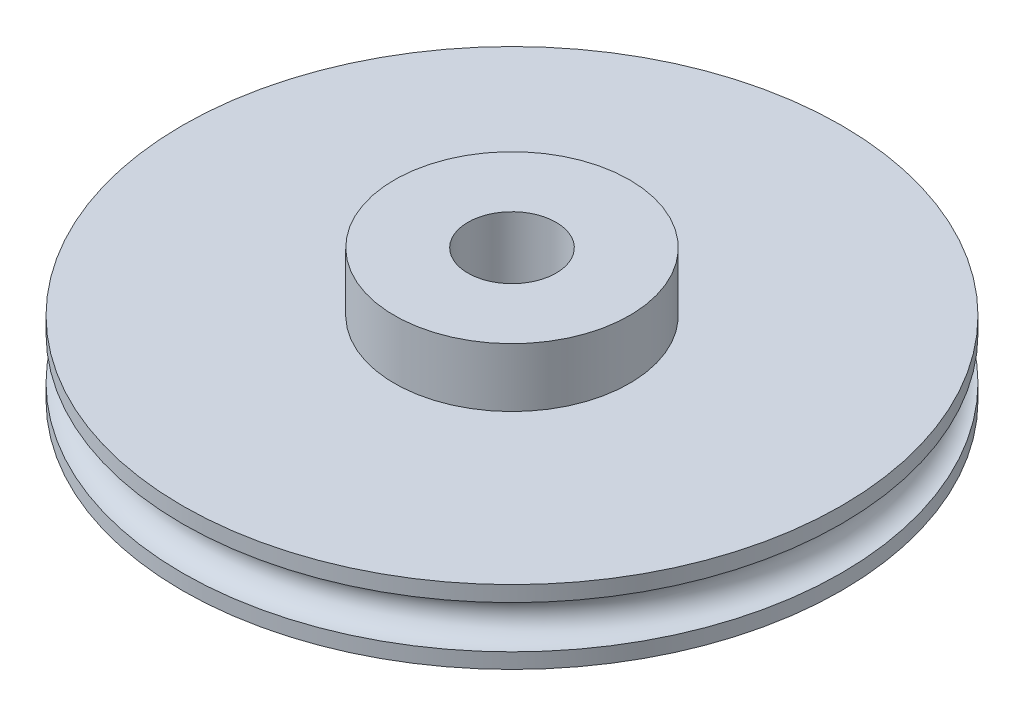
ISO-10303-21;
HEADER;
FILE_DESCRIPTION(('STEP AP214'),'2;1');
FILE_NAME('part.step','',(''),(''),'','','');
FILE_SCHEMA(('AUTOMOTIVE_DESIGN { 1 0 10303 214 1 1 1 1 }'));
ENDSEC;
DATA;
#1=APPLICATION_CONTEXT('core data for automotive mechanical design processes');
#2=APPLICATION_PROTOCOL_DEFINITION('international standard','automotive_design',2000,#1);
#3=PRODUCT_CONTEXT('',#1,'mechanical');
#4=PRODUCT('Part','Part','',(#3));
#5=PRODUCT_RELATED_PRODUCT_CATEGORY('part','',(#4));
#6=PRODUCT_DEFINITION_FORMATION('','',#4);
#7=PRODUCT_DEFINITION_CONTEXT('part definition',#1,'design');
#8=PRODUCT_DEFINITION('design','',#6,#7);
#9=PRODUCT_DEFINITION_SHAPE('','',#8);
#10=(LENGTH_UNIT() NAMED_UNIT(*) SI_UNIT(.MILLI.,.METRE.));
#11=(NAMED_UNIT(*) PLANE_ANGLE_UNIT() SI_UNIT($,.RADIAN.));
#12=(NAMED_UNIT(*) SI_UNIT($,.STERADIAN.) SOLID_ANGLE_UNIT());
#13=UNCERTAINTY_MEASURE_WITH_UNIT(LENGTH_MEASURE(1.E-05),#10,'distance_accuracy_value','');
#14=(GEOMETRIC_REPRESENTATION_CONTEXT(3) GLOBAL_UNCERTAINTY_ASSIGNED_CONTEXT((#13)) GLOBAL_UNIT_ASSIGNED_CONTEXT((#10,
#11,#12)) REPRESENTATION_CONTEXT('',''));
#15=CARTESIAN_POINT('',(0.,0.,0.));
#16=DIRECTION('',(0.,0.,1.));
#17=DIRECTION('',(1.,0.,0.));
#18=AXIS2_PLACEMENT_3D('',#15,#16,#17);
#19=CARTESIAN_POINT('',(0.,2.48732209780174,0.));
#20=DIRECTION('',(0.,-1.,0.));
#21=DIRECTION('',(0.,0.,-1.));
#22=AXIS2_PLACEMENT_3D('',#19,#20,#21);
#23=TOROIDAL_SURFACE('',#22,22.42,1.45);
#24=CARTESIAN_POINT('',(0.,1.03732209780174,0.));
#25=DIRECTION('',(0.,-1.,0.));
#26=DIRECTION('',(0.,0.,-1.));
#27=AXIS2_PLACEMENT_3D('',#24,#25,#26);
#28=CIRCLE('',#27,22.42);
#29=CARTESIAN_POINT('',(0.,1.03732209780174,-22.42));
#30=VERTEX_POINT('',#29);
#31=EDGE_CURVE('E60',#30,#30,#28,.T.);
#32=ORIENTED_EDGE('',*,*,#31,.F.);
#33=EDGE_LOOP('',(#32));
#34=FACE_BOUND('',#33,.T.);
#35=CARTESIAN_POINT('',(0.,3.93732209780174,0.));
#36=DIRECTION('',(0.,-1.,0.));
#37=DIRECTION('',(0.,0.,-1.));
#38=AXIS2_PLACEMENT_3D('',#35,#36,#37);
#39=CIRCLE('',#38,22.42);
#40=CARTESIAN_POINT('',(0.,3.93732209780174,-22.42));
#41=VERTEX_POINT('',#40);
#42=EDGE_CURVE('E10',#41,#41,#39,.T.);
#43=ORIENTED_EDGE('',*,*,#42,.T.);
#44=EDGE_LOOP('',(#43));
#45=FACE_BOUND('',#44,.T.);
#46=ADVANCED_FACE('F32',(#34,#45),#23,.F.);
#47=CARTESIAN_POINT('',(0.,0.,0.));
#48=DIRECTION('',(0.,-1.,0.));
#49=DIRECTION('',(0.,0.,-1.));
#50=AXIS2_PLACEMENT_3D('',#47,#48,#49);
#51=CYLINDRICAL_SURFACE('',#50,22.42);
#52=ORIENTED_EDGE('',*,*,#42,.F.);
#53=EDGE_LOOP('',(#52));
#54=FACE_BOUND('',#53,.T.);
#55=CARTESIAN_POINT('',(0.,5.,0.));
#56=DIRECTION('',(0.,-1.,0.));
#57=DIRECTION('',(0.,0.,-1.));
#58=AXIS2_PLACEMENT_3D('',#55,#56,#57);
#59=CIRCLE('',#58,22.42);
#60=CARTESIAN_POINT('',(0.,5.,-22.42));
#61=VERTEX_POINT('',#60);
#62=EDGE_CURVE('E38',#61,#61,#59,.T.);
#63=ORIENTED_EDGE('',*,*,#62,.T.);
#64=EDGE_LOOP('',(#63));
#65=FACE_BOUND('',#64,.T.);
#66=ADVANCED_FACE('F67',(#54,#65),#51,.T.);
#67=CARTESIAN_POINT('',(5.74888773157453,5.,0.));
#68=DIRECTION('',(0.,-1.,0.));
#69=DIRECTION('',(0.,0.,-1.));
#70=AXIS2_PLACEMENT_3D('',#67,#68,#69);
#71=PLANE('',#70);
#72=ORIENTED_EDGE('',*,*,#62,.F.);
#73=EDGE_LOOP('',(#72));
#74=FACE_BOUND('',#73,.T.);
#75=CARTESIAN_POINT('',(0.,5.,0.));
#76=DIRECTION('',(0.,-1.,0.));
#77=DIRECTION('',(0.,0.,-1.));
#78=AXIS2_PLACEMENT_3D('',#75,#76,#77);
#79=CIRCLE('',#78,8.);
#80=CARTESIAN_POINT('',(0.,5.,-8.));
#81=VERTEX_POINT('',#80);
#82=EDGE_CURVE('E42',#81,#81,#79,.T.);
#83=ORIENTED_EDGE('',*,*,#82,.T.);
#84=EDGE_LOOP('',(#83));
#85=FACE_BOUND('',#84,.T.);
#86=ADVANCED_FACE('F71',(#74,#85),#71,.F.);
#87=CARTESIAN_POINT('',(0.,0.,0.));
#88=DIRECTION('',(0.,-1.,0.));
#89=DIRECTION('',(0.,0.,-1.));
#90=AXIS2_PLACEMENT_3D('',#87,#88,#89);
#91=CYLINDRICAL_SURFACE('',#90,8.);
#92=CARTESIAN_POINT('',(0.,9.,0.));
#93=DIRECTION('',(0.,-1.,0.));
#94=DIRECTION('',(0.,0.,-1.));
#95=AXIS2_PLACEMENT_3D('',#92,#93,#94);
#96=CIRCLE('',#95,8.);
#97=CARTESIAN_POINT('',(0.,9.,-8.));
#98=VERTEX_POINT('',#97);
#99=EDGE_CURVE('E46',#98,#98,#96,.T.);
#100=ORIENTED_EDGE('',*,*,#99,.T.);
#101=EDGE_LOOP('',(#100));
#102=FACE_BOUND('',#101,.T.);
#103=ORIENTED_EDGE('',*,*,#82,.F.);
#104=EDGE_LOOP('',(#103));
#105=FACE_BOUND('',#104,.T.);
#106=ADVANCED_FACE('F76',(#102,#105),#91,.T.);
#107=CARTESIAN_POINT('',(5.74888773157453,9.,0.));
#108=DIRECTION('',(0.,-1.,0.));
#109=DIRECTION('',(0.,0.,-1.));
#110=AXIS2_PLACEMENT_3D('',#107,#108,#109);
#111=PLANE('',#110);
#112=ORIENTED_EDGE('',*,*,#99,.F.);
#113=EDGE_LOOP('',(#112));
#114=FACE_BOUND('',#113,.T.);
#115=CARTESIAN_POINT('',(0.,9.,0.));
#116=DIRECTION('',(0.,-1.,0.));
#117=DIRECTION('',(0.,0.,-1.));
#118=AXIS2_PLACEMENT_3D('',#115,#116,#117);
#119=CIRCLE('',#118,3.);
#120=CARTESIAN_POINT('',(0.,9.,-3.));
#121=VERTEX_POINT('',#120);
#122=EDGE_CURVE('E51',#121,#121,#119,.T.);
#123=ORIENTED_EDGE('',*,*,#122,.T.);
#124=EDGE_LOOP('',(#123));
#125=FACE_BOUND('',#124,.T.);
#126=ADVANCED_FACE('F82',(#114,#125),#111,.F.);
#127=CARTESIAN_POINT('',(0.,0.,0.));
#128=DIRECTION('',(0.,-1.,0.));
#129=DIRECTION('',(0.,0.,-1.));
#130=AXIS2_PLACEMENT_3D('',#127,#128,#129);
#131=CYLINDRICAL_SURFACE('',#130,3.);
#132=ORIENTED_EDGE('',*,*,#122,.F.);
#133=EDGE_LOOP('',(#132));
#134=FACE_BOUND('',#133,.T.);
#135=CARTESIAN_POINT('',(0.,0.,0.));
#136=DIRECTION('',(0.,-1.,0.));
#137=DIRECTION('',(0.,0.,-1.));
#138=AXIS2_PLACEMENT_3D('',#135,#136,#137);
#139=CIRCLE('',#138,3.);
#140=CARTESIAN_POINT('',(0.,0.,-3.));
#141=VERTEX_POINT('',#140);
#142=EDGE_CURVE('E54',#141,#141,#139,.T.);
#143=ORIENTED_EDGE('',*,*,#142,.T.);
#144=EDGE_LOOP('',(#143));
#145=FACE_BOUND('',#144,.T.);
#146=ADVANCED_FACE('F86',(#134,#145),#131,.F.);
#147=CARTESIAN_POINT('',(5.74888773157453,0.,0.));
#148=DIRECTION('',(0.,-1.,0.));
#149=DIRECTION('',(0.,0.,-1.));
#150=AXIS2_PLACEMENT_3D('',#147,#148,#149);
#151=PLANE('',#150);
#152=CARTESIAN_POINT('',(0.,0.,0.));
#153=DIRECTION('',(0.,-1.,0.));
#154=DIRECTION('',(0.,0.,-1.));
#155=AXIS2_PLACEMENT_3D('',#152,#153,#154);
#156=CIRCLE('',#155,22.42);
#157=CARTESIAN_POINT('',(0.,0.,-22.42));
#158=VERTEX_POINT('',#157);
#159=EDGE_CURVE('E57',#158,#158,#156,.T.);
#160=ORIENTED_EDGE('',*,*,#159,.T.);
#161=EDGE_LOOP('',(#160));
#162=FACE_BOUND('',#161,.T.);
#163=ORIENTED_EDGE('',*,*,#142,.F.);
#164=EDGE_LOOP('',(#163));
#165=FACE_BOUND('',#164,.T.);
#166=ADVANCED_FACE('F90',(#162,#165),#151,.T.);
#167=CARTESIAN_POINT('',(0.,0.,0.));
#168=DIRECTION('',(0.,-1.,0.));
#169=DIRECTION('',(0.,0.,-1.));
#170=AXIS2_PLACEMENT_3D('',#167,#168,#169);
#171=CYLINDRICAL_SURFACE('',#170,22.42);
#172=ORIENTED_EDGE('',*,*,#159,.F.);
#173=EDGE_LOOP('',(#172));
#174=FACE_BOUND('',#173,.T.);
#175=ORIENTED_EDGE('',*,*,#31,.T.);
#176=EDGE_LOOP('',(#175));
#177=FACE_BOUND('',#176,.T.);
#178=ADVANCED_FACE('F64',(#174,#177),#171,.T.);
#179=CLOSED_SHELL('',(#46,#66,#86,#106,#126,#146,#166,#178));
#180=MANIFOLD_SOLID_BREP('B2',#179);
#181=ADVANCED_BREP_SHAPE_REPRESENTATION('',(#18,#180),#14);
#182=SHAPE_DEFINITION_REPRESENTATION(#9,#181);
ENDSEC;
END-ISO-10303-21;
